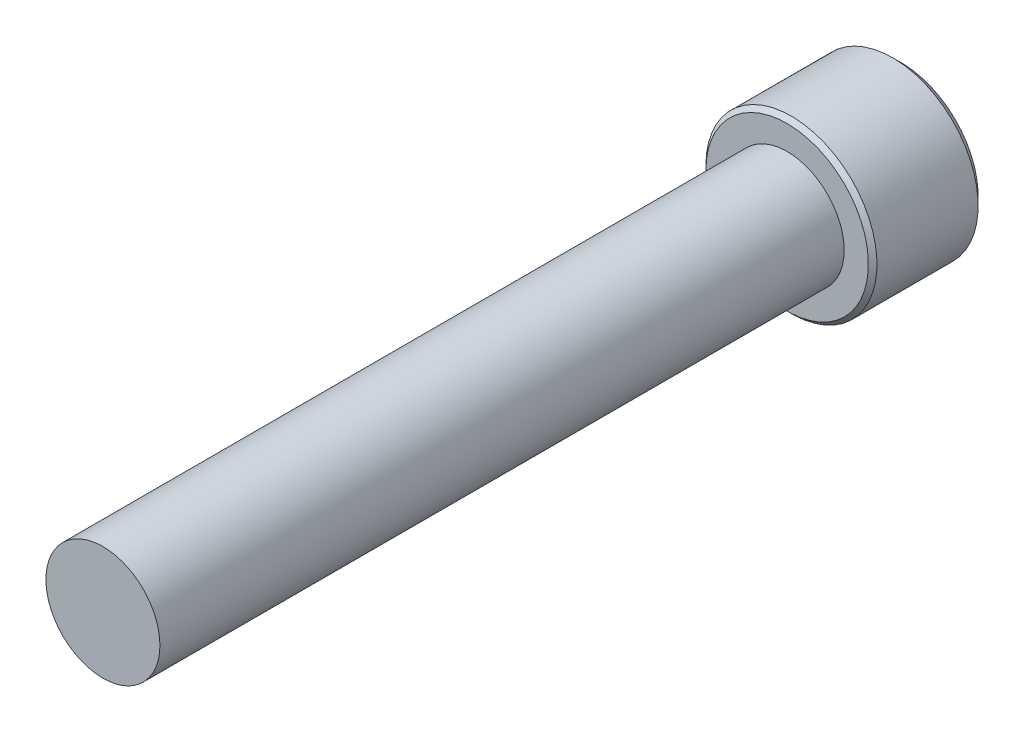
ISO-10303-21;
HEADER;
FILE_DESCRIPTION(('STEP AP214'),'2;1');
FILE_NAME('part.step','',(''),(''),'','','');
FILE_SCHEMA(('AUTOMOTIVE_DESIGN { 1 0 10303 214 1 1 1 1 }'));
ENDSEC;
DATA;
#1=APPLICATION_CONTEXT('core data for automotive mechanical design processes');
#2=APPLICATION_PROTOCOL_DEFINITION('international standard','automotive_design',2000,#1);
#3=PRODUCT_CONTEXT('',#1,'mechanical');
#4=PRODUCT('Part','Part','',(#3));
#5=PRODUCT_RELATED_PRODUCT_CATEGORY('part','',(#4));
#6=PRODUCT_DEFINITION_FORMATION('','',#4);
#7=PRODUCT_DEFINITION_CONTEXT('part definition',#1,'design');
#8=PRODUCT_DEFINITION('design','',#6,#7);
#9=PRODUCT_DEFINITION_SHAPE('','',#8);
#10=(LENGTH_UNIT() NAMED_UNIT(*) SI_UNIT(.MILLI.,.METRE.));
#11=(NAMED_UNIT(*) PLANE_ANGLE_UNIT() SI_UNIT($,.RADIAN.));
#12=(NAMED_UNIT(*) SI_UNIT($,.STERADIAN.) SOLID_ANGLE_UNIT());
#13=UNCERTAINTY_MEASURE_WITH_UNIT(LENGTH_MEASURE(1.E-05),#10,'distance_accuracy_value','');
#14=(GEOMETRIC_REPRESENTATION_CONTEXT(3) GLOBAL_UNCERTAINTY_ASSIGNED_CONTEXT((#13)) GLOBAL_UNIT_ASSIGNED_CONTEXT((#10,
#11,#12)) REPRESENTATION_CONTEXT('',''));
#15=CARTESIAN_POINT('',(0.,0.,0.));
#16=DIRECTION('',(0.,0.,1.));
#17=DIRECTION('',(1.,0.,0.));
#18=AXIS2_PLACEMENT_3D('',#15,#16,#17);
#19=CARTESIAN_POINT('',(0.,0.,-38.1));
#20=DIRECTION('',(0.,0.,1.));
#21=DIRECTION('',(1.,0.,0.));
#22=AXIS2_PLACEMENT_3D('',#19,#20,#21);
#23=CYLINDRICAL_SURFACE('',#22,3.175);
#24=CARTESIAN_POINT('',(0.,0.,-38.1));
#25=DIRECTION('',(0.,0.,-1.));
#26=DIRECTION('',(-1.,0.,0.));
#27=AXIS2_PLACEMENT_3D('',#24,#25,#26);
#28=CIRCLE('',#27,3.175);
#29=CARTESIAN_POINT('',(3.175,0.,-38.1));
#30=VERTEX_POINT('',#29);
#31=EDGE_CURVE('E111',#30,#30,#28,.F.);
#32=CARTESIAN_POINT('',(0.,0.,0.));
#33=DIRECTION('',(0.,0.,1.));
#34=DIRECTION('',(1.,0.,0.));
#35=AXIS2_PLACEMENT_3D('',#32,#33,#34);
#36=CIRCLE('',#35,3.175);
#37=CARTESIAN_POINT('',(3.175,0.,0.));
#38=VERTEX_POINT('',#37);
#39=EDGE_CURVE('E135',#38,#38,#36,.T.);
#40=CARTESIAN_POINT('',(3.175,0.,-38.1));
#41=CARTESIAN_POINT('',(3.175,0.,-37.703125));
#42=CARTESIAN_POINT('',(3.175,0.,-37.30625));
#43=CARTESIAN_POINT('',(3.175,0.,-36.5125));
#44=CARTESIAN_POINT('',(3.175,0.,-36.115625));
#45=CARTESIAN_POINT('',(3.175,0.,-35.321875));
#46=CARTESIAN_POINT('',(3.175,0.,-34.925));
#47=CARTESIAN_POINT('',(3.175,0.,-34.13125));
#48=CARTESIAN_POINT('',(3.175,0.,-33.734375));
#49=CARTESIAN_POINT('',(3.175,0.,-32.940625));
#50=CARTESIAN_POINT('',(3.175,0.,-32.54375));
#51=CARTESIAN_POINT('',(3.175,0.,-31.75));
#52=CARTESIAN_POINT('',(3.175,0.,-31.353125));
#53=CARTESIAN_POINT('',(3.175,0.,-30.559375));
#54=CARTESIAN_POINT('',(3.175,0.,-30.1625));
#55=CARTESIAN_POINT('',(3.175,0.,-29.36875));
#56=CARTESIAN_POINT('',(3.175,0.,-28.971875));
#57=CARTESIAN_POINT('',(3.175,0.,-28.178125));
#58=CARTESIAN_POINT('',(3.175,0.,-27.78125));
#59=CARTESIAN_POINT('',(3.175,0.,-26.9875));
#60=CARTESIAN_POINT('',(3.175,0.,-26.590625));
#61=CARTESIAN_POINT('',(3.175,0.,-25.796875));
#62=CARTESIAN_POINT('',(3.175,0.,-25.4));
#63=CARTESIAN_POINT('',(3.175,0.,-24.60625));
#64=CARTESIAN_POINT('',(3.175,0.,-24.209375));
#65=CARTESIAN_POINT('',(3.175,0.,-23.415625));
#66=CARTESIAN_POINT('',(3.175,0.,-23.01875));
#67=CARTESIAN_POINT('',(3.175,0.,-22.225));
#68=CARTESIAN_POINT('',(3.175,0.,-21.828125));
#69=CARTESIAN_POINT('',(3.175,0.,-21.034375));
#70=CARTESIAN_POINT('',(3.175,0.,-20.6375));
#71=CARTESIAN_POINT('',(3.175,0.,-19.84375));
#72=CARTESIAN_POINT('',(3.175,0.,-19.446875));
#73=CARTESIAN_POINT('',(3.175,0.,-18.653125));
#74=CARTESIAN_POINT('',(3.175,0.,-18.25625));
#75=CARTESIAN_POINT('',(3.175,0.,-17.4625));
#76=CARTESIAN_POINT('',(3.175,0.,-17.065625));
#77=CARTESIAN_POINT('',(3.175,0.,-16.271875));
#78=CARTESIAN_POINT('',(3.175,0.,-15.875));
#79=CARTESIAN_POINT('',(3.175,0.,-15.08125));
#80=CARTESIAN_POINT('',(3.175,0.,-14.684375));
#81=CARTESIAN_POINT('',(3.175,0.,-13.890625));
#82=CARTESIAN_POINT('',(3.175,0.,-13.49375));
#83=CARTESIAN_POINT('',(3.175,0.,-12.7));
#84=CARTESIAN_POINT('',(3.175,0.,-12.303125));
#85=CARTESIAN_POINT('',(3.175,0.,-11.509375));
#86=CARTESIAN_POINT('',(3.175,0.,-11.1125));
#87=CARTESIAN_POINT('',(3.175,0.,-10.31875));
#88=CARTESIAN_POINT('',(3.175,0.,-9.921875));
#89=CARTESIAN_POINT('',(3.175,0.,-9.128125));
#90=CARTESIAN_POINT('',(3.175,0.,-8.73125));
#91=CARTESIAN_POINT('',(3.175,0.,-7.9375));
#92=CARTESIAN_POINT('',(3.175,0.,-7.540625));
#93=CARTESIAN_POINT('',(3.175,0.,-6.746875));
#94=CARTESIAN_POINT('',(3.175,0.,-6.35));
#95=CARTESIAN_POINT('',(3.175,0.,-5.55625));
#96=CARTESIAN_POINT('',(3.175,0.,-5.159375));
#97=CARTESIAN_POINT('',(3.175,0.,-4.365625));
#98=CARTESIAN_POINT('',(3.175,0.,-3.96875));
#99=CARTESIAN_POINT('',(3.175,0.,-3.175));
#100=CARTESIAN_POINT('',(3.175,0.,-2.778125));
#101=CARTESIAN_POINT('',(3.175,0.,-1.984375));
#102=CARTESIAN_POINT('',(3.175,0.,-1.5875));
#103=CARTESIAN_POINT('',(3.175,0.,-0.79375));
#104=CARTESIAN_POINT('',(3.175,0.,-0.396875));
#105=CARTESIAN_POINT('',(3.175,0.,0.));
#106=B_SPLINE_CURVE_WITH_KNOTS('',3,(#40,#41,#42,#43,#44,#45,#46,#47,#48,#49,#50,#51,#52,#53,
#54,#55,#56,#57,#58,#59,#60,#61,#62,#63,#64,#65,#66,#67,#68,#69,#70,#71,#72,#73,#74,#75,#76,#77,
#78,#79,#80,#81,#82,#83,#84,#85,#86,#87,#88,#89,#90,#91,#92,#93,#94,#95,#96,#97,#98,#99,#100,
#101,#102,#103,#104,#105),.UNSPECIFIED.,.F.,.F.,(4,2,2,2,2,2,2,2,2,2,2,2,2,2,2,2,2,2,2,2,2,2,2,
2,2,2,2,2,2,2,2,2,4),(0.,1.19062499999999,2.38124999999999,3.571875,4.7625,5.953125,7.14375,
8.33437499999999,9.525,10.715625,11.90625,13.096875,14.2875,15.478125,16.66875,17.859375,19.05,
20.240625,21.43125,22.621875,23.8125,25.003125,26.19375,27.384375,28.575,29.765625,30.95625,
32.146875,33.3375,34.528125,35.71875,36.909375,38.1),.UNSPECIFIED.);
#107=EDGE_CURVE('BSEAM37',#30,#38,#106,.T.);
#108=ORIENTED_EDGE('',*,*,#31,.T.);
#109=ORIENTED_EDGE('',*,*,#39,.F.);
#110=ORIENTED_EDGE('',*,*,#107,.T.);
#111=ORIENTED_EDGE('',*,*,#107,.F.);
#112=EDGE_LOOP('',(#108,#110,#109,#111));
#113=FACE_BOUND('',#112,.T.);
#114=ADVANCED_FACE('F37',(#113),#23,.T.);
#115=CARTESIAN_POINT('',(0.,0.,-44.45));
#116=DIRECTION('',(0.,0.,1.));
#117=DIRECTION('',(1.,0.,0.));
#118=AXIS2_PLACEMENT_3D('',#115,#116,#117);
#119=CYLINDRICAL_SURFACE('',#118,4.7625);
#120=CARTESIAN_POINT('',(0.,0.,-38.338125));
#121=DIRECTION('',(0.,0.,-1.));
#122=DIRECTION('',(-1.,0.,0.));
#123=AXIS2_PLACEMENT_3D('',#120,#121,#122);
#124=CIRCLE('',#123,4.7625);
#125=CARTESIAN_POINT('',(-4.7625,0.,-38.338125));
#126=VERTEX_POINT('',#125);
#127=EDGE_CURVE('E45',#126,#126,#124,.T.);
#128=ORIENTED_EDGE('',*,*,#127,.T.);
#129=EDGE_LOOP('',(#128));
#130=FACE_BOUND('',#129,.T.);
#131=CARTESIAN_POINT('',(0.,0.,-43.97375));
#132=DIRECTION('',(0.,0.,-1.));
#133=DIRECTION('',(-1.,0.,0.));
#134=AXIS2_PLACEMENT_3D('',#131,#132,#133);
#135=CIRCLE('',#134,4.7625);
#136=CARTESIAN_POINT('',(-4.7625,0.,-43.97375));
#137=VERTEX_POINT('',#136);
#138=EDGE_CURVE('E175',#137,#137,#135,.F.);
#139=ORIENTED_EDGE('',*,*,#138,.T.);
#140=EDGE_LOOP('',(#139));
#141=FACE_BOUND('',#140,.T.);
#142=ADVANCED_FACE('F180',(#130,#141),#119,.T.);
#143=CARTESIAN_POINT('',(0.,0.,-44.45));
#144=DIRECTION('',(0.,0.,-1.));
#145=DIRECTION('',(-1.,0.,0.));
#146=AXIS2_PLACEMENT_3D('',#143,#144,#145);
#147=PLANE('',#146);
#148=CARTESIAN_POINT('',(0.,0.,-44.45));
#149=DIRECTION('',(0.,0.,-1.));
#150=DIRECTION('',(-1.,0.,0.));
#151=AXIS2_PLACEMENT_3D('',#148,#149,#150);
#152=CIRCLE('',#151,4.28625000000001);
#153=CARTESIAN_POINT('',(-4.28625000000001,0.,-44.45));
#154=VERTEX_POINT('',#153);
#155=EDGE_CURVE('E110',#154,#154,#152,.T.);
#156=ORIENTED_EDGE('',*,*,#155,.T.);
#157=EDGE_LOOP('',(#156));
#158=FACE_BOUND('',#157,.T.);
#159=CARTESIAN_POINT('',(0.,0.,-44.45));
#160=DIRECTION('',(0.,0.,-1.));
#161=DIRECTION('',(-1.,0.,0.));
#162=AXIS2_PLACEMENT_3D('',#159,#160,#161);
#163=CIRCLE('',#162,2.74963065701559);
#164=CARTESIAN_POINT('',(-2.38125,1.37481532850779,-44.45));
#165=VERTEX_POINT('',#164);
#166=CARTESIAN_POINT('',(0.,2.74963065701559,-44.45));
#167=VERTEX_POINT('',#166);
#168=EDGE_CURVE('E91',#165,#167,#163,.T.);
#169=ORIENTED_EDGE('',*,*,#168,.F.);
#170=CARTESIAN_POINT('',(-2.38125,-1.3748153285078,-44.45));
#171=VERTEX_POINT('',#170);
#172=EDGE_CURVE('E51',#171,#165,#163,.T.);
#173=ORIENTED_EDGE('',*,*,#172,.F.);
#174=CARTESIAN_POINT('',(0.,-2.74963065701559,-44.45));
#175=VERTEX_POINT('',#174);
#176=EDGE_CURVE('E407',#175,#171,#163,.T.);
#177=ORIENTED_EDGE('',*,*,#176,.F.);
#178=CARTESIAN_POINT('',(2.38125,-1.3748153285078,-44.45));
#179=VERTEX_POINT('',#178);
#180=EDGE_CURVE('E58',#179,#175,#163,.T.);
#181=ORIENTED_EDGE('',*,*,#180,.F.);
#182=CARTESIAN_POINT('',(2.38125,1.3748153285078,-44.45));
#183=VERTEX_POINT('',#182);
#184=EDGE_CURVE('E132',#183,#179,#163,.T.);
#185=ORIENTED_EDGE('',*,*,#184,.F.);
#186=EDGE_CURVE('E100',#167,#183,#163,.T.);
#187=ORIENTED_EDGE('',*,*,#186,.F.);
#188=EDGE_LOOP('',(#169,#173,#177,#181,#185,#187));
#189=FACE_BOUND('',#188,.T.);
#190=ADVANCED_FACE('F131',(#158,#189),#147,.T.);
#191=CARTESIAN_POINT('',(0.,0.,-38.1));
#192=DIRECTION('',(0.,0.,-1.));
#193=DIRECTION('',(-1.,0.,0.));
#194=AXIS2_PLACEMENT_3D('',#191,#192,#193);
#195=PLANE('',#194);
#196=CARTESIAN_POINT('',(0.,0.,-38.1));
#197=DIRECTION('',(0.,0.,-1.));
#198=DIRECTION('',(-1.,0.,0.));
#199=AXIS2_PLACEMENT_3D('',#196,#197,#198);
#200=CIRCLE('',#199,4.52437500000001);
#201=CARTESIAN_POINT('',(-4.52437500000001,0.,-38.1));
#202=VERTEX_POINT('',#201);
#203=EDGE_CURVE('E12',#202,#202,#200,.F.);
#204=ORIENTED_EDGE('',*,*,#203,.T.);
#205=EDGE_LOOP('',(#204));
#206=FACE_BOUND('',#205,.T.);
#207=ORIENTED_EDGE('',*,*,#31,.F.);
#208=EDGE_LOOP('',(#207));
#209=FACE_BOUND('',#208,.T.);
#210=ADVANCED_FACE('F205',(#206,#209),#195,.F.);
#211=CARTESIAN_POINT('',(0.,0.,-44.45));
#212=DIRECTION('',(0.,0.,-1.));
#213=DIRECTION('',(-1.,0.,0.));
#214=AXIS2_PLACEMENT_3D('',#211,#212,#213);
#215=CONICAL_SURFACE('',#214,2.74963065701559,0.78539816339745);
#216=ORIENTED_EDGE('',*,*,#186,.T.);
#217=CARTESIAN_POINT('',(-0.000199999999998987,2.74974612706943,-44.4501154773272));
#218=CARTESIAN_POINT('',(0.0816567823790509,2.70248609172789,-44.4028948967095));
#219=CARTESIAN_POINT('',(0.164882333771761,2.65443579722785,-44.3584475752929));
#220=CARTESIAN_POINT('',(0.334588480838041,2.556455907536,-44.2770654569856));
#221=CARTESIAN_POINT('',(0.421085217353104,2.50651699342501,-44.2401759430951));
#222=CARTESIAN_POINT('',(0.595501774009044,2.40581754748857,-44.1769834131659));
#223=CARTESIAN_POINT('',(0.683377171180676,2.35508266327638,-44.1505215587295));
#224=CARTESIAN_POINT('',(0.861062594070877,2.25249593653965,-44.1097515156161));
#225=CARTESIAN_POINT('',(0.950867191185872,2.20064722822085,-44.0954128915306));
#226=CARTESIAN_POINT('',(1.10563960313034,2.11128933452158,-44.0824757847701));
#227=CARTESIAN_POINT('',(1.17040744896962,2.07389560129144,-44.0805606046532));
#228=CARTESIAN_POINT('',(1.29983727933557,1.99916925388849,-44.0837866227677));
#229=CARTESIAN_POINT('',(1.36449921879336,1.96183666573621,-44.0889302948571));
#230=CARTESIAN_POINT('',(1.4932125485774,1.88752399013711,-44.1059813108716));
#231=CARTESIAN_POINT('',(1.55726317423486,1.85054434417201,-44.1178962213493));
#232=CARTESIAN_POINT('',(1.68425683890527,1.77722451768916,-44.147835672352));
#233=CARTESIAN_POINT('',(1.74719996243583,1.74088428837517,-44.1658597445185));
#234=CARTESIAN_POINT('',(1.90842615073218,1.64780030516185,-44.2193688075524));
#235=CARTESIAN_POINT('',(2.00570949128784,1.59163374230437,-44.2588874208722));
#236=CARTESIAN_POINT('',(2.14875606262557,1.50904576583588,-44.3256003435508));
#237=CARTESIAN_POINT('',(2.19589628894396,1.48182934348129,-44.3490402091113));
#238=CARTESIAN_POINT('',(2.28930352636664,1.42790064981106,-44.3980566766595));
#239=CARTESIAN_POINT('',(2.33557105249682,1.40118808114506,-44.4236319667669));
#240=CARTESIAN_POINT('',(2.38145,1.37469985845396,-44.4501154773272));
#241=B_SPLINE_CURVE_WITH_KNOTS('',3,(#217,#218,#219,#220,#221,#222,#223,#224,#225,#226,#227,
#228,#229,#230,#231,#232,#233,#234,#235,#236,#237,#238,#239,#240),.UNSPECIFIED.,.F.,.F.,(4,2,2,
2,2,2,2,2,2,2,2,4),(0.,0.317196610611949,0.636241461041219,0.950218950629222,1.26340583824126,
1.48752413747844,1.71172100167747,1.93616888974082,2.16059957440836,2.51709639744763,
2.69486147369099,2.87251813383153),.UNSPECIFIED.);
#242=EDGE_CURVE('E105',#167,#183,#241,.T.);
#243=ORIENTED_EDGE('',*,*,#242,.F.);
#244=EDGE_LOOP('',(#216,#243));
#245=FACE_BOUND('',#244,.T.);
#246=ADVANCED_FACE('F106',(#245),#215,.F.);
#247=ORIENTED_EDGE('',*,*,#184,.T.);
#248=CARTESIAN_POINT('',(2.38125,-2.74194290589386,-45.3319808945799));
#249=CARTESIAN_POINT('',(2.38125,-2.67517961056039,-45.2815846679781));
#250=CARTESIAN_POINT('',(2.38125,-2.60804251112752,-45.2316755875907));
#251=CARTESIAN_POINT('',(2.38125,-2.47287325055307,-45.1330498309857));
#252=CARTESIAN_POINT('',(2.38125,-2.40484086895313,-45.0843334572448));
#253=CARTESIAN_POINT('',(2.38125,-2.26723593505441,-44.9879648544535));
#254=CARTESIAN_POINT('',(2.38125,-2.19765553346049,-44.9403237954326));
#255=CARTESIAN_POINT('',(2.38125,-2.05731367842203,-44.8468199233866));
#256=CARTESIAN_POINT('',(2.38125,-1.98655230892573,-44.8009569847287));
#257=CARTESIAN_POINT('',(2.38125,-1.83957751909225,-44.7088459007133));
#258=CARTESIAN_POINT('',(2.38125,-1.76328361992075,-44.6627255173929));
#259=CARTESIAN_POINT('',(2.38125,-1.6089135770446,-44.5735183038905));
#260=CARTESIAN_POINT('',(2.38125,-1.53083712149137,-44.5304320099754));
#261=CARTESIAN_POINT('',(2.38125,-1.37291620334514,-44.4482265014712));
#262=CARTESIAN_POINT('',(2.38125,-1.29307799938228,-44.4090953578519));
#263=CARTESIAN_POINT('',(2.38125,-1.13121425093132,-44.3356679503152));
#264=CARTESIAN_POINT('',(2.38125,-1.04918943681795,-44.3013700954538));
#265=CARTESIAN_POINT('',(2.38125,-0.88953525675927,-44.2413546314156));
#266=CARTESIAN_POINT('',(2.38125,-0.812083865770257,-44.215168478432));
#267=CARTESIAN_POINT('',(2.38125,-0.655316366527661,-44.1690097514868));
#268=CARTESIAN_POINT('',(2.38125,-0.576000130216829,-44.1490376055837));
#269=CARTESIAN_POINT('',(2.38125,-0.417295761573374,-44.1166821452488));
#270=CARTESIAN_POINT('',(2.38125,-0.337934576883846,-44.1041688083547));
#271=CARTESIAN_POINT('',(2.38125,-0.178363852969583,-44.0869738601659));
#272=CARTESIAN_POINT('',(2.38125,-0.098154461961766,-44.0822909026126));
#273=CARTESIAN_POINT('',(2.38125,0.0594188034321301,-44.0811044408392));
#274=CARTESIAN_POINT('',(2.38125,0.136780588525994,-44.0843110105046));
#275=CARTESIAN_POINT('',(2.38125,0.290840960607339,-44.0980870567428));
#276=CARTESIAN_POINT('',(2.38125,0.367539482435409,-44.1086572485871));
#277=CARTESIAN_POINT('',(2.38125,0.521017492835388,-44.1367628298525));
#278=CARTESIAN_POINT('',(2.38125,0.597774958394048,-44.1544167489315));
#279=CARTESIAN_POINT('',(2.38125,0.749609814257009,-44.1957513962434));
#280=CARTESIAN_POINT('',(2.38125,0.824687344568026,-44.2194316201904));
#281=CARTESIAN_POINT('',(2.38125,1.06107814410025,-44.302894862956));
#282=CARTESIAN_POINT('',(2.38125,1.2190478622181,-44.3721839270396));
#283=CARTESIAN_POINT('',(2.38125,1.45021000267342,-44.4876640838597));
#284=CARTESIAN_POINT('',(2.38125,1.52644290442584,-44.5281730572583));
#285=CARTESIAN_POINT('',(2.38125,1.67717618538172,-44.6123026892371));
#286=CARTESIAN_POINT('',(2.38125,1.7516768735884,-44.6559227870999));
#287=CARTESIAN_POINT('',(2.38125,1.89548152088328,-44.743412556489));
#288=CARTESIAN_POINT('',(2.38125,1.96485959608998,-44.7871617927418));
#289=CARTESIAN_POINT('',(2.38125,2.10242624411169,-44.8765011587307));
#290=CARTESIAN_POINT('',(2.38125,2.17061472626633,-44.922091427904));
#291=CARTESIAN_POINT('',(2.38125,2.30540317317354,-45.0144060050932));
#292=CARTESIAN_POINT('',(2.38125,2.37201154222166,-45.0611180928962));
#293=CARTESIAN_POINT('',(2.38125,2.50431800054459,-45.1557775780183));
#294=CARTESIAN_POINT('',(2.38125,2.57001633510792,-45.2037246320963));
#295=CARTESIAN_POINT('',(2.38125,2.63533378855947,-45.2521767335425));
#296=B_SPLINE_CURVE_WITH_KNOTS('',3,(#248,#249,#250,#251,#252,#253,#254,#255,#256,#257,#258,
#259,#260,#261,#262,#263,#264,#265,#266,#267,#268,#269,#270,#271,#272,#273,#274,#275,#276,#277,
#278,#279,#280,#281,#282,#283,#284,#285,#286,#287,#288,#289,#290,#291,#292,#293,#294,#295),
.UNSPECIFIED.,.F.,.F.,(4,2,2,2,2,2,2,2,2,2,2,2,2,2,2,2,2,2,2,2,2,2,2,4),(0.,0.250951284009982,
0.50196556482788,0.754924775973582,1.00786608164542,1.27526207798892,1.54270521780082,
1.80931602029339,2.07583885812519,2.32089852590464,2.56597507114536,2.80664400307698,
3.04727155311265,3.27918940971451,3.51112979698762,3.74712477407482,3.98310000940111,
4.49898139184704,4.75794323931354,5.01685853149448,5.26288960015361,5.50893933794671,
5.75299038397142,5.9969743162797),.UNSPECIFIED.);
#297=EDGE_CURVE('E99',#183,#179,#296,.F.);
#298=ORIENTED_EDGE('',*,*,#297,.F.);
#299=EDGE_LOOP('',(#247,#298));
#300=FACE_BOUND('',#299,.T.);
#301=ADVANCED_FACE('F228',(#300),#215,.F.);
#302=ORIENTED_EDGE('',*,*,#180,.T.);
#303=CARTESIAN_POINT('',(2.38145,-1.37469985845396,-44.4501154773272));
#304=CARTESIAN_POINT('',(2.29959321762095,-1.4219598937955,-44.4028948967095));
#305=CARTESIAN_POINT('',(2.21636766622824,-1.47001018829554,-44.3584475752929));
#306=CARTESIAN_POINT('',(2.04666151916196,-1.56799007798739,-44.2770654569856));
#307=CARTESIAN_POINT('',(1.96016478264689,-1.61792899209838,-44.2401759430951));
#308=CARTESIAN_POINT('',(1.78574822599096,-1.71862843803482,-44.1769834131659));
#309=CARTESIAN_POINT('',(1.69787282881932,-1.76936332224701,-44.1505215587295));
#310=CARTESIAN_POINT('',(1.52018740592912,-1.87195004898374,-44.1097515156161));
#311=CARTESIAN_POINT('',(1.43038280881413,-1.92379875730254,-44.0954128915306));
#312=CARTESIAN_POINT('',(1.27561039686966,-2.01315665100181,-44.0824757847701));
#313=CARTESIAN_POINT('',(1.21084255103038,-2.05055038423195,-44.0805606046532));
#314=CARTESIAN_POINT('',(1.08141272066442,-2.1252767316349,-44.0837866227677));
#315=CARTESIAN_POINT('',(1.01675078120664,-2.16260931978718,-44.0889302948571));
#316=CARTESIAN_POINT('',(0.888037451422601,-2.23692199538629,-44.1059813108716));
#317=CARTESIAN_POINT('',(0.823986825765144,-2.27390164135138,-44.1178962213493));
#318=CARTESIAN_POINT('',(0.696993161094725,-2.34722146783423,-44.147835672352));
#319=CARTESIAN_POINT('',(0.634050037564174,-2.38356169714823,-44.1658597445185));
#320=CARTESIAN_POINT('',(0.472823849267818,-2.47664568036154,-44.2193688075524));
#321=CARTESIAN_POINT('',(0.375540508712161,-2.53281224321902,-44.2588874208722));
#322=CARTESIAN_POINT('',(0.232493937374433,-2.61540021968751,-44.3256003435508));
#323=CARTESIAN_POINT('',(0.185353711056038,-2.64261664204209,-44.3490402091113));
#324=CARTESIAN_POINT('',(0.0919464736333649,-2.69654533571233,-44.3980566766595));
#325=CARTESIAN_POINT('',(0.0456789475031815,-2.72325790437833,-44.4236319667669));
#326=CARTESIAN_POINT('',(-0.000199999999997933,-2.74974612706943,-44.4501154773272));
#327=B_SPLINE_CURVE_WITH_KNOTS('',3,(#303,#304,#305,#306,#307,#308,#309,#310,#311,#312,#313,
#314,#315,#316,#317,#318,#319,#320,#321,#322,#323,#324,#325,#326),.UNSPECIFIED.,.F.,.F.,(4,2,2,
2,2,2,2,2,2,2,2,4),(0.,0.317196610611951,0.636241461041219,0.950218950629224,1.26340583824126,
1.48752413747844,1.71172100167747,1.93616888974082,2.16059957440836,2.51709639744762,
2.69486147369098,2.87251813383153),.UNSPECIFIED.);
#328=EDGE_CURVE('E144',#179,#175,#327,.T.);
#329=ORIENTED_EDGE('',*,*,#328,.F.);
#330=EDGE_LOOP('',(#302,#329));
#331=FACE_BOUND('',#330,.T.);
#332=ADVANCED_FACE('F235',(#331),#215,.F.);
#333=ORIENTED_EDGE('',*,*,#176,.T.);
#334=CARTESIAN_POINT('',(0.000199999999999919,-2.74974612706943,-44.4501154773272));
#335=CARTESIAN_POINT('',(-0.0816567823790499,-2.70248609172789,-44.4028948967095));
#336=CARTESIAN_POINT('',(-0.16488233377176,-2.65443579722785,-44.3584475752929));
#337=CARTESIAN_POINT('',(-0.334588480838041,-2.556455907536,-44.2770654569856));
#338=CARTESIAN_POINT('',(-0.421085217353104,-2.50651699342501,-44.2401759430951));
#339=CARTESIAN_POINT('',(-0.595501774009043,-2.40581754748857,-44.1769834131659));
#340=CARTESIAN_POINT('',(-0.683377171180676,-2.35508266327639,-44.1505215587295));
#341=CARTESIAN_POINT('',(-0.861062594070877,-2.25249593653965,-44.1097515156161));
#342=CARTESIAN_POINT('',(-0.950867191185872,-2.20064722822085,-44.0954128915306));
#343=CARTESIAN_POINT('',(-1.10563960313034,-2.11128933452158,-44.0824757847701));
#344=CARTESIAN_POINT('',(-1.17040744896962,-2.07389560129144,-44.0805606046532));
#345=CARTESIAN_POINT('',(-1.29983727933558,-1.99916925388849,-44.0837866227677));
#346=CARTESIAN_POINT('',(-1.36449921879336,-1.96183666573622,-44.0889302948571));
#347=CARTESIAN_POINT('',(-1.4932125485774,-1.88752399013711,-44.1059813108716));
#348=CARTESIAN_POINT('',(-1.55726317423486,-1.85054434417201,-44.1178962213493));
#349=CARTESIAN_POINT('',(-1.68425683890527,-1.77722451768917,-44.147835672352));
#350=CARTESIAN_POINT('',(-1.74719996243583,-1.74088428837517,-44.1658597445185));
#351=CARTESIAN_POINT('',(-1.90842615073218,-1.64780030516185,-44.2193688075524));
#352=CARTESIAN_POINT('',(-2.00570949128784,-1.59163374230437,-44.2588874208722));
#353=CARTESIAN_POINT('',(-2.14875606262557,-1.50904576583588,-44.3256003435508));
#354=CARTESIAN_POINT('',(-2.19589628894397,-1.48182934348129,-44.3490402091113));
#355=CARTESIAN_POINT('',(-2.28930352636664,-1.42790064981106,-44.3980566766595));
#356=CARTESIAN_POINT('',(-2.33557105249682,-1.40118808114506,-44.4236319667669));
#357=CARTESIAN_POINT('',(-2.38145,-1.37469985845396,-44.4501154773272));
#358=B_SPLINE_CURVE_WITH_KNOTS('',3,(#334,#335,#336,#337,#338,#339,#340,#341,#342,#343,#344,
#345,#346,#347,#348,#349,#350,#351,#352,#353,#354,#355,#356,#357),.UNSPECIFIED.,.F.,.F.,(4,2,2,
2,2,2,2,2,2,2,2,4),(0.,0.317196610611949,0.636241461041218,0.950218950629223,1.26340583824126,
1.48752413747844,1.71172100167747,1.93616888974082,2.16059957440836,2.51709639744763,
2.69486147369099,2.87251813383154),.UNSPECIFIED.);
#359=EDGE_CURVE('E368',#175,#171,#358,.T.);
#360=ORIENTED_EDGE('',*,*,#359,.F.);
#361=EDGE_LOOP('',(#333,#360));
#362=FACE_BOUND('',#361,.T.);
#363=ADVANCED_FACE('F242',(#362),#215,.F.);
#364=ORIENTED_EDGE('',*,*,#172,.T.);
#365=CARTESIAN_POINT('',(-2.38125,-2.7419429062928,-45.3319808948811));
#366=CARTESIAN_POINT('',(-2.38125,-2.67517961094813,-45.2815846682677));
#367=CARTESIAN_POINT('',(-2.38125,-2.60804251150403,-45.2316755878687));
#368=CARTESIAN_POINT('',(-2.38125,-2.47287325090701,-45.1330498312406));
#369=CARTESIAN_POINT('',(-2.38125,-2.40484086929572,-45.0843334574882));
#370=CARTESIAN_POINT('',(-2.38125,-2.26723593537394,-44.9879648546737));
#371=CARTESIAN_POINT('',(-2.38125,-2.1976555337683,-44.9403237956413));
#372=CARTESIAN_POINT('',(-2.38125,-2.05731367870617,-44.8468199235723));
#373=CARTESIAN_POINT('',(-2.38125,-1.98655230919793,-44.800956984903));
#374=CARTESIAN_POINT('',(-2.38125,-1.83957751933871,-44.7088459008639));
#375=CARTESIAN_POINT('',(-2.38125,-1.76328362015337,-44.6627255175311));
#376=CARTESIAN_POINT('',(-2.38125,-1.60891357724903,-44.5735183040048));
#377=CARTESIAN_POINT('',(-2.38125,-1.53083712168147,-44.530432010078));
#378=CARTESIAN_POINT('',(-2.38125,-1.37291620350604,-44.4482265015513));
#379=CARTESIAN_POINT('',(-2.38125,-1.29307799952833,-44.4090953579213));
#380=CARTESIAN_POINT('',(-2.38125,-1.13121425104688,-44.3356679503644));
#381=CARTESIAN_POINT('',(-2.38125,-1.04918943691786,-44.3013700954936));
#382=CARTESIAN_POINT('',(-2.38125,-0.88953525685242,-44.2413546314485));
#383=CARTESIAN_POINT('',(-2.38125,-0.812083865872979,-44.2151684784655));
#384=CARTESIAN_POINT('',(-2.38125,-0.655316366649839,-44.1690097515196));
#385=CARTESIAN_POINT('',(-2.38125,-0.576000130348891,-44.1490376056152));
#386=CARTESIAN_POINT('',(-2.38125,-0.417295761724876,-44.1166821452753));
#387=CARTESIAN_POINT('',(-2.38125,-0.337934577044901,-44.1041688083777));
#388=CARTESIAN_POINT('',(-2.38125,-0.178363853149423,-44.0869738601797));
#389=CARTESIAN_POINT('',(-2.38125,-0.0981544621508393,-44.0822909026207));
#390=CARTESIAN_POINT('',(-2.38125,0.0594188032260211,-44.0811044408343));
#391=CARTESIAN_POINT('',(-2.38125,0.136780588312058,-44.0843110104925));
#392=CARTESIAN_POINT('',(-2.38125,0.290840960378534,-44.0980870567153));
#393=CARTESIAN_POINT('',(-2.38125,0.367539482199561,-44.1086572485512));
#394=CARTESIAN_POINT('',(-2.38125,0.521017492585636,-44.1367628297993));
#395=CARTESIAN_POINT('',(-2.38125,0.597774958137456,-44.1544167488691));
#396=CARTESIAN_POINT('',(-2.38125,0.749609813987397,-44.1957513961625));
#397=CARTESIAN_POINT('',(-2.38125,0.824687344292234,-44.2194316201001));
#398=CARTESIAN_POINT('',(-2.38125,1.0610781437644,-44.3028948628217));
#399=CARTESIAN_POINT('',(-2.38125,1.21904786183136,-44.3721839268647));
#400=CARTESIAN_POINT('',(-2.38125,1.45021000221342,-44.4876640836208));
#401=CARTESIAN_POINT('',(-2.38125,1.52644290394186,-44.5281730569973));
#402=CARTESIAN_POINT('',(-2.38125,1.67717618485053,-44.6123026889314));
#403=CARTESIAN_POINT('',(-2.38125,1.75167687303399,-44.6559227867715));
#404=CARTESIAN_POINT('',(-2.38125,1.89548152028666,-44.7434125561176));
#405=CARTESIAN_POINT('',(-2.38125,1.96485959547432,-44.78716179235));
#406=CARTESIAN_POINT('',(-2.38125,2.10242624345817,-44.8765011582982));
#407=CARTESIAN_POINT('',(-2.38125,2.17061472559403,-44.9220914274512));
#408=CARTESIAN_POINT('',(-2.38125,2.30540317246412,-45.0144060045998));
#409=CARTESIAN_POINT('',(-2.38125,2.3720115414939,-45.0611180923826));
#410=CARTESIAN_POINT('',(-2.38125,2.50431799978028,-45.1557775774644));
#411=CARTESIAN_POINT('',(-2.38125,2.57001633432539,-45.2037246315223));
#412=CARTESIAN_POINT('',(-2.38125,2.63533378775875,-45.2521767329484));
#413=B_SPLINE_CURVE_WITH_KNOTS('',3,(#365,#366,#367,#368,#369,#370,#371,#372,#373,#374,#375,
#376,#377,#378,#379,#380,#381,#382,#383,#384,#385,#386,#387,#388,#389,#390,#391,#392,#393,#394,
#395,#396,#397,#398,#399,#400,#401,#402,#403,#404,#405,#406,#407,#408,#409,#410,#411,#412),
.UNSPECIFIED.,.F.,.F.,(4,2,2,2,2,2,2,2,2,2,2,2,2,2,2,2,2,2,2,2,2,2,2,4),(0.,0.250951284057753,
0.50196556492343,0.754924776117811,1.00786608183831,1.27526207823639,1.54270521810291,
1.80931602064962,2.07583885853549,2.32089852628726,2.56597507150035,2.80664400340548,
3.04727155341464,3.27918940999225,3.51112979724108,3.74712477430216,3.98310000960232,
4.49898139186047,4.75794323923241,5.01685853131885,5.26288959989712,5.50893933760937,
5.7529903835543,5.99697431578283),.UNSPECIFIED.);
#414=EDGE_CURVE('E121',#171,#165,#413,.T.);
#415=ORIENTED_EDGE('',*,*,#414,.F.);
#416=EDGE_LOOP('',(#364,#415));
#417=FACE_BOUND('',#416,.T.);
#418=ADVANCED_FACE('F248',(#417),#215,.F.);
#419=ORIENTED_EDGE('',*,*,#168,.T.);
#420=CARTESIAN_POINT('',(-2.38145,1.37469985845396,-44.4501154773272));
#421=CARTESIAN_POINT('',(-2.29959321762095,1.4219598937955,-44.4028948967095));
#422=CARTESIAN_POINT('',(-2.21636766622824,1.47001018829554,-44.3584475752929));
#423=CARTESIAN_POINT('',(-2.04666151916196,1.56799007798739,-44.2770654569856));
#424=CARTESIAN_POINT('',(-1.9601647826469,1.61792899209838,-44.2401759430951));
#425=CARTESIAN_POINT('',(-1.78574822599096,1.71862843803482,-44.1769834131659));
#426=CARTESIAN_POINT('',(-1.69787282881932,1.76936332224701,-44.1505215587295));
#427=CARTESIAN_POINT('',(-1.52018740592912,1.87195004898374,-44.1097515156161));
#428=CARTESIAN_POINT('',(-1.43038280881413,1.92379875730254,-44.0954128915306));
#429=CARTESIAN_POINT('',(-1.27561039686966,2.01315665100181,-44.0824757847701));
#430=CARTESIAN_POINT('',(-1.21084255103038,2.05055038423195,-44.0805606046532));
#431=CARTESIAN_POINT('',(-1.08141272066442,2.1252767316349,-44.0837866227677));
#432=CARTESIAN_POINT('',(-1.01675078120664,2.16260931978718,-44.0889302948571));
#433=CARTESIAN_POINT('',(-0.888037451422599,2.23692199538629,-44.1059813108716));
#434=CARTESIAN_POINT('',(-0.823986825765142,2.27390164135138,-44.1178962213493));
#435=CARTESIAN_POINT('',(-0.696993161094723,2.34722146783423,-44.147835672352));
#436=CARTESIAN_POINT('',(-0.634050037564172,2.38356169714823,-44.1658597445185));
#437=CARTESIAN_POINT('',(-0.472823849267815,2.47664568036154,-44.2193688075524));
#438=CARTESIAN_POINT('',(-0.375540508712157,2.53281224321902,-44.2588874208722));
#439=CARTESIAN_POINT('',(-0.232493937374426,2.61540021968751,-44.3256003435508));
#440=CARTESIAN_POINT('',(-0.18535371105603,2.6426166420421,-44.3490402091113));
#441=CARTESIAN_POINT('',(-0.091946473633358,2.69654533571234,-44.3980566766595));
#442=CARTESIAN_POINT('',(-0.0456789475031766,2.72325790437833,-44.4236319667669));
#443=CARTESIAN_POINT('',(0.000200000000000198,2.74974612706943,-44.4501154773272));
#444=B_SPLINE_CURVE_WITH_KNOTS('',3,(#420,#421,#422,#423,#424,#425,#426,#427,#428,#429,#430,
#431,#432,#433,#434,#435,#436,#437,#438,#439,#440,#441,#442,#443),.UNSPECIFIED.,.F.,.F.,(4,2,2,
2,2,2,2,2,2,2,2,4),(0.,0.317196610611951,0.636241461041219,0.950218950629224,1.26340583824126,
1.48752413747844,1.71172100167747,1.93616888974082,2.16059957440836,2.51709639744763,
2.69486147369099,2.87251813383154),.UNSPECIFIED.);
#445=EDGE_CURVE('E95',#165,#167,#444,.T.);
#446=ORIENTED_EDGE('',*,*,#445,.F.);
#447=EDGE_LOOP('',(#419,#446));
#448=FACE_BOUND('',#447,.T.);
#449=ADVANCED_FACE('F93',(#448),#215,.F.);
#450=CARTESIAN_POINT('',(2.38125,4.12444598552339,-40.878125));
#451=DIRECTION('',(0.,0.,-1.));
#452=DIRECTION('',(-1.,0.,0.));
#453=AXIS2_PLACEMENT_3D('',#450,#451,#452);
#454=PLANE('',#453);
#455=DIRECTION('',(0.866025403784439,0.5,0.));
#456=VECTOR('',#455,1.);
#457=CARTESIAN_POINT('',(-2.38125,1.3748153285078,-40.878125));
#458=LINE('',#457,#456);
#459=CARTESIAN_POINT('',(-2.38125,1.3748153285078,-40.878125));
#460=VERTEX_POINT('',#459);
#461=CARTESIAN_POINT('',(0.,2.74963065701559,-40.878125));
#462=VERTEX_POINT('',#461);
#463=EDGE_CURVE('E120',#460,#462,#458,.T.);
#464=ORIENTED_EDGE('',*,*,#463,.T.);
#465=DIRECTION('',(0.866025403784439,-0.5,0.));
#466=VECTOR('',#465,1.);
#467=CARTESIAN_POINT('',(0.,2.74963065701559,-40.878125));
#468=LINE('',#467,#466);
#469=CARTESIAN_POINT('',(2.38125,1.3748153285078,-40.878125));
#470=VERTEX_POINT('',#469);
#471=EDGE_CURVE('E125',#462,#470,#468,.T.);
#472=ORIENTED_EDGE('',*,*,#471,.T.);
#473=DIRECTION('',(0.,-1.,0.));
#474=VECTOR('',#473,1.);
#475=CARTESIAN_POINT('',(2.38125,1.3748153285078,-40.878125));
#476=LINE('',#475,#474);
#477=CARTESIAN_POINT('',(2.38125,-1.3748153285078,-40.878125));
#478=VERTEX_POINT('',#477);
#479=EDGE_CURVE('E380',#470,#478,#476,.T.);
#480=ORIENTED_EDGE('',*,*,#479,.T.);
#481=DIRECTION('',(-0.866025403784439,-0.5,0.));
#482=VECTOR('',#481,1.);
#483=CARTESIAN_POINT('',(2.38125,-1.3748153285078,-40.878125));
#484=LINE('',#483,#482);
#485=CARTESIAN_POINT('',(0.,-2.74963065701559,-40.878125));
#486=VERTEX_POINT('',#485);
#487=EDGE_CURVE('E383',#478,#486,#484,.T.);
#488=ORIENTED_EDGE('',*,*,#487,.T.);
#489=DIRECTION('',(-0.866025403784439,0.5,0.));
#490=VECTOR('',#489,1.);
#491=CARTESIAN_POINT('',(0.,-2.74963065701559,-40.878125));
#492=LINE('',#491,#490);
#493=CARTESIAN_POINT('',(-2.38125,-1.3748153285078,-40.878125));
#494=VERTEX_POINT('',#493);
#495=EDGE_CURVE('E386',#486,#494,#492,.T.);
#496=ORIENTED_EDGE('',*,*,#495,.T.);
#497=DIRECTION('',(0.,1.,0.));
#498=VECTOR('',#497,1.);
#499=CARTESIAN_POINT('',(-2.38125,-1.3748153285078,-40.878125));
#500=LINE('',#499,#498);
#501=EDGE_CURVE('E128',#494,#460,#500,.T.);
#502=ORIENTED_EDGE('',*,*,#501,.T.);
#503=EDGE_LOOP('',(#464,#472,#480,#488,#496,#502));
#504=FACE_BOUND('',#503,.T.);
#505=ADVANCED_FACE('F164',(#504),#454,.T.);
#506=CARTESIAN_POINT('',(0.,2.74963065701559,-40.878125));
#507=DIRECTION('',(0.5,0.866025403784439,0.));
#508=DIRECTION('',(-0.866025403784439,0.5,0.));
#509=AXIS2_PLACEMENT_3D('',#506,#507,#508);
#510=PLANE('',#509);
#511=DIRECTION('',(0.,0.,-1.));
#512=VECTOR('',#511,1.);
#513=CARTESIAN_POINT('',(0.,2.74963065701559,-40.878125));
#514=LINE('',#513,#512);
#515=EDGE_CURVE('E117',#462,#167,#514,.T.);
#516=ORIENTED_EDGE('',*,*,#515,.T.);
#517=ORIENTED_EDGE('',*,*,#242,.T.);
#518=DIRECTION('',(0.,0.,-1.));
#519=VECTOR('',#518,1.);
#520=CARTESIAN_POINT('',(2.38125,1.3748153285078,-40.878125));
#521=LINE('',#520,#519);
#522=EDGE_CURVE('E127',#470,#183,#521,.T.);
#523=ORIENTED_EDGE('',*,*,#522,.F.);
#524=ORIENTED_EDGE('',*,*,#471,.F.);
#525=EDGE_LOOP('',(#516,#517,#523,#524));
#526=FACE_BOUND('',#525,.T.);
#527=ADVANCED_FACE('F123',(#526),#510,.F.);
#528=CARTESIAN_POINT('',(2.38125,1.3748153285078,-40.878125));
#529=DIRECTION('',(1.,0.,0.));
#530=DIRECTION('',(0.,1.,0.));
#531=AXIS2_PLACEMENT_3D('',#528,#529,#530);
#532=PLANE('',#531);
#533=ORIENTED_EDGE('',*,*,#522,.T.);
#534=ORIENTED_EDGE('',*,*,#297,.T.);
#535=DIRECTION('',(0.,0.,-1.));
#536=VECTOR('',#535,1.);
#537=CARTESIAN_POINT('',(2.38125,-1.3748153285078,-40.878125));
#538=LINE('',#537,#536);
#539=EDGE_CURVE('E397',#478,#179,#538,.T.);
#540=ORIENTED_EDGE('',*,*,#539,.F.);
#541=ORIENTED_EDGE('',*,*,#479,.F.);
#542=EDGE_LOOP('',(#533,#534,#540,#541));
#543=FACE_BOUND('',#542,.T.);
#544=ADVANCED_FACE('F153',(#543),#532,.F.);
#545=CARTESIAN_POINT('',(2.38125,-1.3748153285078,-40.878125));
#546=DIRECTION('',(0.5,-0.866025403784439,0.));
#547=DIRECTION('',(0.866025403784439,0.5,0.));
#548=AXIS2_PLACEMENT_3D('',#545,#546,#547);
#549=PLANE('',#548);
#550=ORIENTED_EDGE('',*,*,#539,.T.);
#551=ORIENTED_EDGE('',*,*,#328,.T.);
#552=DIRECTION('',(0.,0.,-1.));
#553=VECTOR('',#552,1.);
#554=CARTESIAN_POINT('',(0.,-2.74963065701559,-40.878125));
#555=LINE('',#554,#553);
#556=EDGE_CURVE('E394',#486,#175,#555,.T.);
#557=ORIENTED_EDGE('',*,*,#556,.F.);
#558=ORIENTED_EDGE('',*,*,#487,.F.);
#559=EDGE_LOOP('',(#550,#551,#557,#558));
#560=FACE_BOUND('',#559,.T.);
#561=ADVANCED_FACE('F157',(#560),#549,.F.);
#562=CARTESIAN_POINT('',(0.,-2.74963065701559,-40.878125));
#563=DIRECTION('',(-0.5,-0.866025403784439,0.));
#564=DIRECTION('',(0.866025403784439,-0.5,0.));
#565=AXIS2_PLACEMENT_3D('',#562,#563,#564);
#566=PLANE('',#565);
#567=ORIENTED_EDGE('',*,*,#556,.T.);
#568=ORIENTED_EDGE('',*,*,#359,.T.);
#569=DIRECTION('',(0.,0.,-1.));
#570=VECTOR('',#569,1.);
#571=CARTESIAN_POINT('',(-2.38125,-1.3748153285078,-40.878125));
#572=LINE('',#571,#570);
#573=EDGE_CURVE('E392',#494,#171,#572,.T.);
#574=ORIENTED_EDGE('',*,*,#573,.F.);
#575=ORIENTED_EDGE('',*,*,#495,.F.);
#576=EDGE_LOOP('',(#567,#568,#574,#575));
#577=FACE_BOUND('',#576,.T.);
#578=ADVANCED_FACE('F278',(#577),#566,.F.);
#579=CARTESIAN_POINT('',(-2.38125,-1.3748153285078,-40.878125));
#580=DIRECTION('',(-1.,0.,0.));
#581=DIRECTION('',(0.,-1.,0.));
#582=AXIS2_PLACEMENT_3D('',#579,#580,#581);
#583=PLANE('',#582);
#584=ORIENTED_EDGE('',*,*,#573,.T.);
#585=ORIENTED_EDGE('',*,*,#414,.T.);
#586=DIRECTION('',(0.,0.,-1.));
#587=VECTOR('',#586,1.);
#588=CARTESIAN_POINT('',(-2.38125,1.3748153285078,-40.878125));
#589=LINE('',#588,#587);
#590=EDGE_CURVE('E119',#460,#165,#589,.T.);
#591=ORIENTED_EDGE('',*,*,#590,.F.);
#592=ORIENTED_EDGE('',*,*,#501,.F.);
#593=EDGE_LOOP('',(#584,#585,#591,#592));
#594=FACE_BOUND('',#593,.T.);
#595=ADVANCED_FACE('F285',(#594),#583,.F.);
#596=CARTESIAN_POINT('',(-2.38125,1.3748153285078,-40.878125));
#597=DIRECTION('',(-0.5,0.866025403784439,0.));
#598=DIRECTION('',(-0.866025403784439,-0.5,0.));
#599=AXIS2_PLACEMENT_3D('',#596,#597,#598);
#600=PLANE('',#599);
#601=ORIENTED_EDGE('',*,*,#590,.T.);
#602=ORIENTED_EDGE('',*,*,#445,.T.);
#603=ORIENTED_EDGE('',*,*,#515,.F.);
#604=ORIENTED_EDGE('',*,*,#463,.F.);
#605=EDGE_LOOP('',(#601,#602,#603,#604));
#606=FACE_BOUND('',#605,.T.);
#607=ADVANCED_FACE('F115',(#606),#600,.F.);
#608=CARTESIAN_POINT('',(0.,0.,-44.45));
#609=DIRECTION('',(0.,0.,1.));
#610=DIRECTION('',(1.,0.,0.));
#611=AXIS2_PLACEMENT_3D('',#608,#609,#610);
#612=CONICAL_SURFACE('',#611,4.28625000000001,0.785398163397453);
#613=ORIENTED_EDGE('',*,*,#138,.F.);
#614=EDGE_LOOP('',(#613));
#615=FACE_BOUND('',#614,.T.);
#616=ORIENTED_EDGE('',*,*,#155,.F.);
#617=EDGE_LOOP('',(#616));
#618=FACE_BOUND('',#617,.T.);
#619=ADVANCED_FACE('F185',(#615,#618),#612,.T.);
#620=CARTESIAN_POINT('',(0.,0.,-38.338125));
#621=DIRECTION('',(0.,0.,-1.));
#622=DIRECTION('',(-1.,0.,0.));
#623=AXIS2_PLACEMENT_3D('',#620,#621,#622);
#624=CONICAL_SURFACE('',#623,4.7625,0.78539816339745);
#625=ORIENTED_EDGE('',*,*,#203,.F.);
#626=EDGE_LOOP('',(#625));
#627=FACE_BOUND('',#626,.T.);
#628=ORIENTED_EDGE('',*,*,#127,.F.);
#629=EDGE_LOOP('',(#628));
#630=FACE_BOUND('',#629,.T.);
#631=ADVANCED_FACE('F39',(#627,#630),#624,.T.);
#632=CARTESIAN_POINT('',(0.,0.,0.));
#633=DIRECTION('',(0.,0.,1.));
#634=DIRECTION('',(1.,0.,0.));
#635=AXIS2_PLACEMENT_3D('',#632,#633,#634);
#636=PLANE('',#635);
#637=ORIENTED_EDGE('',*,*,#39,.T.);
#638=EDGE_LOOP('',(#637));
#639=FACE_BOUND('',#638,.T.);
#640=ADVANCED_FACE('F184',(#639),#636,.T.);
#641=CLOSED_SHELL('',(#114,#142,#190,#210,#246,#301,#332,#363,#418,#449,#505,#527,#544,#561,
#578,#595,#607,#619,#631,#640));
#642=MANIFOLD_SOLID_BREP('B2',#641);
#643=ADVANCED_BREP_SHAPE_REPRESENTATION('',(#18,#642),#14);
#644=SHAPE_DEFINITION_REPRESENTATION(#9,#643);
ENDSEC;
END-ISO-10303-21;
